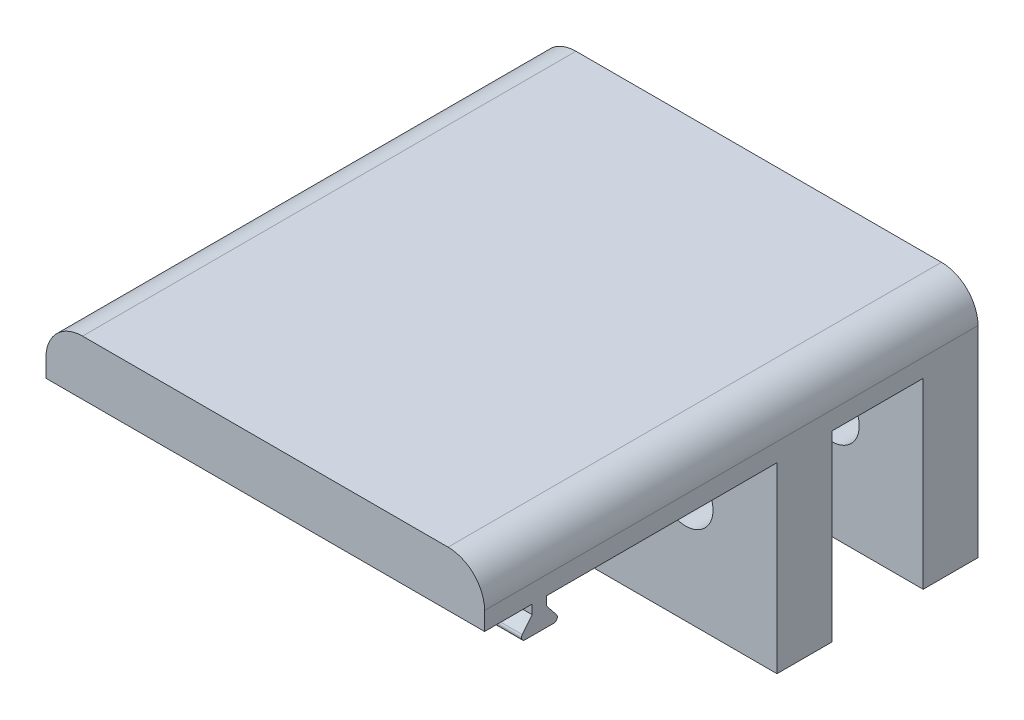
ISO-10303-21;
HEADER;
FILE_DESCRIPTION(('STEP AP214'),'2;1');
FILE_NAME('part.step','',(''),(''),'','','');
FILE_SCHEMA(('AUTOMOTIVE_DESIGN { 1 0 10303 214 1 1 1 1 }'));
ENDSEC;
DATA;
#1=APPLICATION_CONTEXT('core data for automotive mechanical design processes');
#2=APPLICATION_PROTOCOL_DEFINITION('international standard','automotive_design',2000,#1);
#3=PRODUCT_CONTEXT('',#1,'mechanical');
#4=PRODUCT('Part','Part','',(#3));
#5=PRODUCT_RELATED_PRODUCT_CATEGORY('part','',(#4));
#6=PRODUCT_DEFINITION_FORMATION('','',#4);
#7=PRODUCT_DEFINITION_CONTEXT('part definition',#1,'design');
#8=PRODUCT_DEFINITION('design','',#6,#7);
#9=PRODUCT_DEFINITION_SHAPE('','',#8);
#10=(LENGTH_UNIT() NAMED_UNIT(*) SI_UNIT(.MILLI.,.METRE.));
#11=(NAMED_UNIT(*) PLANE_ANGLE_UNIT() SI_UNIT($,.RADIAN.));
#12=(NAMED_UNIT(*) SI_UNIT($,.STERADIAN.) SOLID_ANGLE_UNIT());
#13=UNCERTAINTY_MEASURE_WITH_UNIT(LENGTH_MEASURE(1.E-05),#10,'distance_accuracy_value','');
#14=(GEOMETRIC_REPRESENTATION_CONTEXT(3) GLOBAL_UNCERTAINTY_ASSIGNED_CONTEXT((#13)) GLOBAL_UNIT_ASSIGNED_CONTEXT((#10,
#11,#12)) REPRESENTATION_CONTEXT('',''));
#15=CARTESIAN_POINT('',(0.,0.,0.));
#16=DIRECTION('',(0.,0.,1.));
#17=DIRECTION('',(1.,0.,0.));
#18=AXIS2_PLACEMENT_3D('',#15,#16,#17);
#19=CARTESIAN_POINT('',(-12.,5.,21.5));
#20=DIRECTION('',(0.,1.,0.));
#21=DIRECTION('',(0.,0.,1.));
#22=AXIS2_PLACEMENT_3D('',#19,#20,#21);
#23=PLANE('',#22);
#24=DIRECTION('',(1.,0.,0.));
#25=VECTOR('',#24,1.);
#26=CARTESIAN_POINT('',(-12.,5.,18.1));
#27=LINE('',#26,#25);
#28=CARTESIAN_POINT('',(-12.,5.,18.1));
#29=VERTEX_POINT('',#28);
#30=CARTESIAN_POINT('',(12.,5.,18.1));
#31=VERTEX_POINT('',#30);
#32=EDGE_CURVE('E206',#29,#31,#27,.T.);
#33=ORIENTED_EDGE('',*,*,#32,.F.);
#34=DIRECTION('',(0.,0.,-1.));
#35=VECTOR('',#34,1.);
#36=CARTESIAN_POINT('',(-12.,5.,21.5));
#37=LINE('',#36,#35);
#38=CARTESIAN_POINT('',(-12.,5.,5.5));
#39=VERTEX_POINT('',#38);
#40=EDGE_CURVE('E194',#29,#39,#37,.T.);
#41=ORIENTED_EDGE('',*,*,#40,.T.);
#42=DIRECTION('',(1.,0.,0.));
#43=VECTOR('',#42,1.);
#44=CARTESIAN_POINT('',(-12.,5.,5.5));
#45=LINE('',#44,#43);
#46=CARTESIAN_POINT('',(12.,5.,5.5));
#47=VERTEX_POINT('',#46);
#48=EDGE_CURVE('E250',#39,#47,#45,.T.);
#49=ORIENTED_EDGE('',*,*,#48,.T.);
#50=DIRECTION('',(0.,0.,-1.));
#51=VECTOR('',#50,1.);
#52=CARTESIAN_POINT('',(12.,5.,21.5));
#53=LINE('',#52,#51);
#54=EDGE_CURVE('E268',#31,#47,#53,.T.);
#55=ORIENTED_EDGE('',*,*,#54,.F.);
#56=EDGE_LOOP('',(#33,#41,#49,#55));
#57=FACE_BOUND('',#56,.T.);
#58=ADVANCED_FACE('F50',(#57),#23,.F.);
#59=CARTESIAN_POINT('',(0.,0.,5.5));
#60=DIRECTION('',(0.,0.,-1.));
#61=DIRECTION('',(-1.,0.,0.));
#62=AXIS2_PLACEMENT_3D('',#59,#60,#61);
#63=PLANE('',#62);
#64=CARTESIAN_POINT('',(7.,1.,5.5));
#65=DIRECTION('',(0.,0.,1.));
#66=DIRECTION('',(-1.,0.,0.));
#67=AXIS2_PLACEMENT_3D('',#64,#65,#66);
#68=CIRCLE('',#67,1.5);
#69=CARTESIAN_POINT('',(5.5,1.,5.5));
#70=VERTEX_POINT('',#69);
#71=EDGE_CURVE('E336',#70,#70,#68,.T.);
#72=ORIENTED_EDGE('',*,*,#71,.F.);
#73=EDGE_LOOP('',(#72));
#74=FACE_BOUND('',#73,.T.);
#75=CARTESIAN_POINT('',(-7.,1.,5.5));
#76=DIRECTION('',(0.,0.,1.));
#77=DIRECTION('',(1.,0.,0.));
#78=AXIS2_PLACEMENT_3D('',#75,#76,#77);
#79=CIRCLE('',#78,1.5);
#80=CARTESIAN_POINT('',(-5.5,1.,5.5));
#81=VERTEX_POINT('',#80);
#82=EDGE_CURVE('E349',#81,#81,#79,.T.);
#83=ORIENTED_EDGE('',*,*,#82,.F.);
#84=EDGE_LOOP('',(#83));
#85=FACE_BOUND('',#84,.T.);
#86=ORIENTED_EDGE('',*,*,#48,.F.);
#87=DIRECTION('',(0.,-1.,0.));
#88=VECTOR('',#87,1.);
#89=CARTESIAN_POINT('',(-12.,-5.,5.5));
#90=LINE('',#89,#88);
#91=CARTESIAN_POINT('',(-12.,-5.,5.5));
#92=VERTEX_POINT('',#91);
#93=EDGE_CURVE('E356',#39,#92,#90,.T.);
#94=ORIENTED_EDGE('',*,*,#93,.T.);
#95=DIRECTION('',(1.,0.,0.));
#96=VECTOR('',#95,1.);
#97=CARTESIAN_POINT('',(-12.,-5.,5.5));
#98=LINE('',#97,#96);
#99=CARTESIAN_POINT('',(12.,-5.,5.5));
#100=VERTEX_POINT('',#99);
#101=EDGE_CURVE('E365',#92,#100,#98,.T.);
#102=ORIENTED_EDGE('',*,*,#101,.T.);
#103=DIRECTION('',(0.,1.,0.));
#104=VECTOR('',#103,1.);
#105=CARTESIAN_POINT('',(12.,-5.,5.5));
#106=LINE('',#105,#104);
#107=EDGE_CURVE('E354',#100,#47,#106,.T.);
#108=ORIENTED_EDGE('',*,*,#107,.T.);
#109=EDGE_LOOP('',(#86,#94,#102,#108));
#110=FACE_BOUND('',#109,.T.);
#111=ADVANCED_FACE('F484',(#74,#85,#110),#63,.F.);
#112=CARTESIAN_POINT('',(0.,5.,0.));
#113=DIRECTION('',(0.,1.,0.));
#114=DIRECTION('',(0.,0.,1.));
#115=AXIS2_PLACEMENT_3D('',#112,#113,#114);
#116=PLANE('',#115);
#117=DIRECTION('',(-1.,0.,0.));
#118=VECTOR('',#117,1.);
#119=CARTESIAN_POINT('',(12.,5.,-2.5));
#120=LINE('',#119,#118);
#121=CARTESIAN_POINT('',(12.,5.,-2.5));
#122=VERTEX_POINT('',#121);
#123=CARTESIAN_POINT('',(-12.,5.,-2.5));
#124=VERTEX_POINT('',#123);
#125=EDGE_CURVE('E308',#122,#124,#120,.T.);
#126=ORIENTED_EDGE('',*,*,#125,.F.);
#127=DIRECTION('',(0.,0.,-1.));
#128=VECTOR('',#127,1.);
#129=CARTESIAN_POINT('',(12.,5.,-5.5));
#130=LINE('',#129,#128);
#131=CARTESIAN_POINT('',(12.,5.,2.5));
#132=VERTEX_POINT('',#131);
#133=EDGE_CURVE('E329',#132,#122,#130,.T.);
#134=ORIENTED_EDGE('',*,*,#133,.F.);
#135=DIRECTION('',(-1.,0.,0.));
#136=VECTOR('',#135,1.);
#137=CARTESIAN_POINT('',(-12.,5.,2.5));
#138=LINE('',#137,#136);
#139=CARTESIAN_POINT('',(-12.,5.,2.5));
#140=VERTEX_POINT('',#139);
#141=EDGE_CURVE('E367',#132,#140,#138,.T.);
#142=ORIENTED_EDGE('',*,*,#141,.T.);
#143=DIRECTION('',(0.,0.,1.));
#144=VECTOR('',#143,1.);
#145=CARTESIAN_POINT('',(-12.,5.,-5.5));
#146=LINE('',#145,#144);
#147=EDGE_CURVE('E319',#124,#140,#146,.T.);
#148=ORIENTED_EDGE('',*,*,#147,.F.);
#149=EDGE_LOOP('',(#126,#134,#142,#148));
#150=FACE_BOUND('',#149,.T.);
#151=ADVANCED_FACE('F498',(#150),#116,.F.);
#152=CARTESIAN_POINT('',(0.,0.,2.5));
#153=DIRECTION('',(0.,0.,-1.));
#154=DIRECTION('',(-1.,0.,0.));
#155=AXIS2_PLACEMENT_3D('',#152,#153,#154);
#156=PLANE('',#155);
#157=CARTESIAN_POINT('',(-7.,1.,2.5));
#158=DIRECTION('',(0.,0.,1.));
#159=DIRECTION('',(1.,0.,0.));
#160=AXIS2_PLACEMENT_3D('',#157,#158,#159);
#161=CIRCLE('',#160,1.5);
#162=CARTESIAN_POINT('',(-5.5,1.,2.5));
#163=VERTEX_POINT('',#162);
#164=EDGE_CURVE('E345',#163,#163,#161,.T.);
#165=ORIENTED_EDGE('',*,*,#164,.T.);
#166=EDGE_LOOP('',(#165));
#167=FACE_BOUND('',#166,.T.);
#168=DIRECTION('',(0.,1.,0.));
#169=VECTOR('',#168,1.);
#170=CARTESIAN_POINT('',(12.,-5.,2.5));
#171=LINE('',#170,#169);
#172=CARTESIAN_POINT('',(12.,-5.,2.5));
#173=VERTEX_POINT('',#172);
#174=EDGE_CURVE('E347',#173,#132,#171,.T.);
#175=ORIENTED_EDGE('',*,*,#174,.F.);
#176=DIRECTION('',(1.,0.,0.));
#177=VECTOR('',#176,1.);
#178=CARTESIAN_POINT('',(-12.,-5.,2.5));
#179=LINE('',#178,#177);
#180=CARTESIAN_POINT('',(-12.,-5.,2.5));
#181=VERTEX_POINT('',#180);
#182=EDGE_CURVE('E360',#181,#173,#179,.T.);
#183=ORIENTED_EDGE('',*,*,#182,.F.);
#184=DIRECTION('',(0.,-1.,0.));
#185=VECTOR('',#184,1.);
#186=CARTESIAN_POINT('',(-12.,-5.,2.5));
#187=LINE('',#186,#185);
#188=EDGE_CURVE('E373',#140,#181,#187,.T.);
#189=ORIENTED_EDGE('',*,*,#188,.F.);
#190=ORIENTED_EDGE('',*,*,#141,.F.);
#191=EDGE_LOOP('',(#175,#183,#189,#190));
#192=FACE_BOUND('',#191,.T.);
#193=CARTESIAN_POINT('',(7.,1.,2.5));
#194=DIRECTION('',(0.,0.,1.));
#195=DIRECTION('',(-1.,0.,0.));
#196=AXIS2_PLACEMENT_3D('',#193,#194,#195);
#197=CIRCLE('',#196,1.5);
#198=CARTESIAN_POINT('',(5.5,1.,2.5));
#199=VERTEX_POINT('',#198);
#200=EDGE_CURVE('E340',#199,#199,#197,.T.);
#201=ORIENTED_EDGE('',*,*,#200,.T.);
#202=EDGE_LOOP('',(#201));
#203=FACE_BOUND('',#202,.T.);
#204=ADVANCED_FACE('F492',(#167,#192,#203),#156,.T.);
#205=CARTESIAN_POINT('',(12.,-5.,5.5));
#206=DIRECTION('',(-1.,0.,0.));
#207=DIRECTION('',(0.,0.,1.));
#208=AXIS2_PLACEMENT_3D('',#205,#206,#207);
#209=PLANE('',#208);
#210=DIRECTION('',(0.,-1.,0.));
#211=VECTOR('',#210,1.);
#212=CARTESIAN_POINT('',(12.,8.,-5.5));
#213=LINE('',#212,#211);
#214=CARTESIAN_POINT('',(12.,6.,-5.5));
#215=VERTEX_POINT('',#214);
#216=CARTESIAN_POINT('',(12.,-5.,-5.5));
#217=VERTEX_POINT('',#216);
#218=EDGE_CURVE('E334',#215,#217,#213,.T.);
#219=ORIENTED_EDGE('',*,*,#218,.F.);
#220=DIRECTION('',(0.,0.,-1.));
#221=VECTOR('',#220,1.);
#222=CARTESIAN_POINT('',(12.,6.,21.5));
#223=LINE('',#222,#221);
#224=CARTESIAN_POINT('',(12.,6.,21.5));
#225=VERTEX_POINT('',#224);
#226=EDGE_CURVE('E73',#215,#225,#223,.F.);
#227=ORIENTED_EDGE('',*,*,#226,.T.);
#228=DIRECTION('',(0.,1.,0.));
#229=VECTOR('',#228,1.);
#230=CARTESIAN_POINT('',(12.,8.,21.5));
#231=LINE('',#230,#229);
#232=CARTESIAN_POINT('',(12.,5.,21.5));
#233=VERTEX_POINT('',#232);
#234=EDGE_CURVE('E258',#233,#225,#231,.T.);
#235=ORIENTED_EDGE('',*,*,#234,.F.);
#236=CARTESIAN_POINT('',(12.,5.,18.9));
#237=VERTEX_POINT('',#236);
#238=EDGE_CURVE('E267',#233,#237,#53,.T.);
#239=ORIENTED_EDGE('',*,*,#238,.T.);
#240=DIRECTION('',(0.,-1.,0.));
#241=VECTOR('',#240,1.);
#242=CARTESIAN_POINT('',(12.,0.,18.9));
#243=LINE('',#242,#241);
#244=CARTESIAN_POINT('',(12.,4.5,18.9));
#245=VERTEX_POINT('',#244);
#246=EDGE_CURVE('E240',#237,#245,#243,.T.);
#247=ORIENTED_EDGE('',*,*,#246,.T.);
#248=DIRECTION('',(0.,-0.78086880944303,0.624695047554424));
#249=VECTOR('',#248,1.);
#250=CARTESIAN_POINT('',(12.,10.9756097560976,13.719512195122));
#251=LINE('',#250,#249);
#252=CARTESIAN_POINT('',(12.,3.82493900951088,19.4400487923913));
#253=VERTEX_POINT('',#252);
#254=EDGE_CURVE('E218',#245,#253,#251,.T.);
#255=ORIENTED_EDGE('',*,*,#254,.T.);
#256=CARTESIAN_POINT('',(12.,3.7,19.2838750305027));
#257=DIRECTION('',(-1.,0.,0.));
#258=DIRECTION('',(0.,0.,1.));
#259=AXIS2_PLACEMENT_3D('',#256,#257,#258);
#260=CIRCLE('',#259,0.2);
#261=CARTESIAN_POINT('',(12.,3.5,19.2838750305027));
#262=VERTEX_POINT('',#261);
#263=EDGE_CURVE('E391',#253,#262,#260,.F.);
#264=ORIENTED_EDGE('',*,*,#263,.T.);
#265=DIRECTION('',(0.,0.,-1.));
#266=VECTOR('',#265,1.);
#267=CARTESIAN_POINT('',(12.,3.5,0.));
#268=LINE('',#267,#266);
#269=CARTESIAN_POINT('',(12.,3.5,17.7161249694973));
#270=VERTEX_POINT('',#269);
#271=EDGE_CURVE('E213',#262,#270,#268,.T.);
#272=ORIENTED_EDGE('',*,*,#271,.T.);
#273=CARTESIAN_POINT('',(12.,3.7,17.7161249694973));
#274=DIRECTION('',(-1.,0.,0.));
#275=DIRECTION('',(0.,0.,1.));
#276=AXIS2_PLACEMENT_3D('',#273,#274,#275);
#277=CIRCLE('',#276,0.2);
#278=CARTESIAN_POINT('',(12.,3.82493900951088,17.5599512076087));
#279=VERTEX_POINT('',#278);
#280=EDGE_CURVE('E392',#270,#279,#277,.F.);
#281=ORIENTED_EDGE('',*,*,#280,.T.);
#282=DIRECTION('',(0.,-0.78086880944303,-0.624695047554424));
#283=VECTOR('',#282,1.);
#284=CARTESIAN_POINT('',(12.,-7.07317073170732,8.84146341463415));
#285=LINE('',#284,#283);
#286=CARTESIAN_POINT('',(12.,4.5,18.1));
#287=VERTEX_POINT('',#286);
#288=EDGE_CURVE('E235',#287,#279,#285,.T.);
#289=ORIENTED_EDGE('',*,*,#288,.F.);
#290=DIRECTION('',(0.,-1.,0.));
#291=VECTOR('',#290,1.);
#292=CARTESIAN_POINT('',(12.,0.,18.1));
#293=LINE('',#292,#291);
#294=EDGE_CURVE('E201',#31,#287,#293,.T.);
#295=ORIENTED_EDGE('',*,*,#294,.F.);
#296=ORIENTED_EDGE('',*,*,#54,.T.);
#297=ORIENTED_EDGE('',*,*,#107,.F.);
#298=DIRECTION('',(0.,0.,-1.));
#299=VECTOR('',#298,1.);
#300=CARTESIAN_POINT('',(12.,-5.,5.5));
#301=LINE('',#300,#299);
#302=EDGE_CURVE('E362',#100,#173,#301,.T.);
#303=ORIENTED_EDGE('',*,*,#302,.T.);
#304=ORIENTED_EDGE('',*,*,#174,.T.);
#305=ORIENTED_EDGE('',*,*,#133,.T.);
#306=DIRECTION('',(0.,1.,0.));
#307=VECTOR('',#306,1.);
#308=CARTESIAN_POINT('',(12.,-5.,-2.5));
#309=LINE('',#308,#307);
#310=CARTESIAN_POINT('',(12.,-5.,-2.5));
#311=VERTEX_POINT('',#310);
#312=EDGE_CURVE('E302',#311,#122,#309,.T.);
#313=ORIENTED_EDGE('',*,*,#312,.F.);
#314=DIRECTION('',(0.,0.,1.));
#315=VECTOR('',#314,1.);
#316=CARTESIAN_POINT('',(12.,-5.,-5.5));
#317=LINE('',#316,#315);
#318=EDGE_CURVE('E299',#217,#311,#317,.T.);
#319=ORIENTED_EDGE('',*,*,#318,.F.);
#320=EDGE_LOOP('',(#219,#227,#235,#239,#247,#255,#264,#272,#281,#289,#295,#296,#297,#303,#304,
#305,#313,#319));
#321=FACE_BOUND('',#320,.T.);
#322=ADVANCED_FACE('F442',(#321),#209,.F.);
#323=CARTESIAN_POINT('',(-12.,-5.,5.5));
#324=DIRECTION('',(1.,0.,0.));
#325=DIRECTION('',(0.,0.,-1.));
#326=AXIS2_PLACEMENT_3D('',#323,#324,#325);
#327=PLANE('',#326);
#328=DIRECTION('',(0.,-1.,0.));
#329=VECTOR('',#328,1.);
#330=CARTESIAN_POINT('',(-12.,8.,21.5));
#331=LINE('',#330,#329);
#332=CARTESIAN_POINT('',(-12.,6.,21.5));
#333=VERTEX_POINT('',#332);
#334=CARTESIAN_POINT('',(-12.,5.,21.5));
#335=VERTEX_POINT('',#334);
#336=EDGE_CURVE('E251',#333,#335,#331,.T.);
#337=ORIENTED_EDGE('',*,*,#336,.F.);
#338=DIRECTION('',(0.,0.,1.));
#339=VECTOR('',#338,1.);
#340=CARTESIAN_POINT('',(-12.,6.,-5.5));
#341=LINE('',#340,#339);
#342=CARTESIAN_POINT('',(-12.,6.,-5.5));
#343=VERTEX_POINT('',#342);
#344=EDGE_CURVE('E11',#333,#343,#341,.F.);
#345=ORIENTED_EDGE('',*,*,#344,.T.);
#346=DIRECTION('',(0.,-1.,0.));
#347=VECTOR('',#346,1.);
#348=CARTESIAN_POINT('',(-12.,8.,-5.5));
#349=LINE('',#348,#347);
#350=CARTESIAN_POINT('',(-12.,-5.,-5.5));
#351=VERTEX_POINT('',#350);
#352=EDGE_CURVE('E323',#343,#351,#349,.T.);
#353=ORIENTED_EDGE('',*,*,#352,.T.);
#354=DIRECTION('',(0.,0.,1.));
#355=VECTOR('',#354,1.);
#356=CARTESIAN_POINT('',(-12.,-5.,-5.5));
#357=LINE('',#356,#355);
#358=CARTESIAN_POINT('',(-12.,-5.,-2.5));
#359=VERTEX_POINT('',#358);
#360=EDGE_CURVE('E314',#351,#359,#357,.T.);
#361=ORIENTED_EDGE('',*,*,#360,.T.);
#362=DIRECTION('',(0.,-1.,0.));
#363=VECTOR('',#362,1.);
#364=CARTESIAN_POINT('',(-12.,5.,-2.5));
#365=LINE('',#364,#363);
#366=EDGE_CURVE('E297',#124,#359,#365,.T.);
#367=ORIENTED_EDGE('',*,*,#366,.F.);
#368=ORIENTED_EDGE('',*,*,#147,.T.);
#369=ORIENTED_EDGE('',*,*,#188,.T.);
#370=DIRECTION('',(0.,0.,-1.));
#371=VECTOR('',#370,1.);
#372=CARTESIAN_POINT('',(-12.,-5.,5.5));
#373=LINE('',#372,#371);
#374=EDGE_CURVE('E382',#92,#181,#373,.T.);
#375=ORIENTED_EDGE('',*,*,#374,.F.);
#376=ORIENTED_EDGE('',*,*,#93,.F.);
#377=ORIENTED_EDGE('',*,*,#40,.F.);
#378=DIRECTION('',(0.,-1.,0.));
#379=VECTOR('',#378,1.);
#380=CARTESIAN_POINT('',(-12.,0.,18.1));
#381=LINE('',#380,#379);
#382=CARTESIAN_POINT('',(-12.,4.5,18.1));
#383=VERTEX_POINT('',#382);
#384=EDGE_CURVE('E187',#29,#383,#381,.T.);
#385=ORIENTED_EDGE('',*,*,#384,.T.);
#386=DIRECTION('',(0.,-0.78086880944303,-0.624695047554424));
#387=VECTOR('',#386,1.);
#388=CARTESIAN_POINT('',(-12.,-7.07317073170732,8.84146341463415));
#389=LINE('',#388,#387);
#390=CARTESIAN_POINT('',(-12.,3.82493900951088,17.5599512076087));
#391=VERTEX_POINT('',#390);
#392=EDGE_CURVE('E188',#383,#391,#389,.T.);
#393=ORIENTED_EDGE('',*,*,#392,.T.);
#394=CARTESIAN_POINT('',(-12.,3.7,17.7161249694973));
#395=DIRECTION('',(1.,0.,0.));
#396=DIRECTION('',(0.,0.,-1.));
#397=AXIS2_PLACEMENT_3D('',#394,#395,#396);
#398=CIRCLE('',#397,0.2);
#399=CARTESIAN_POINT('',(-12.,3.5,17.7161249694973));
#400=VERTEX_POINT('',#399);
#401=EDGE_CURVE('E401',#391,#400,#398,.F.);
#402=ORIENTED_EDGE('',*,*,#401,.T.);
#403=DIRECTION('',(0.,0.,-1.));
#404=VECTOR('',#403,1.);
#405=CARTESIAN_POINT('',(-12.,3.5,0.));
#406=LINE('',#405,#404);
#407=CARTESIAN_POINT('',(-12.,3.5,19.2838750305027));
#408=VERTEX_POINT('',#407);
#409=EDGE_CURVE('E209',#408,#400,#406,.T.);
#410=ORIENTED_EDGE('',*,*,#409,.F.);
#411=CARTESIAN_POINT('',(-12.,3.7,19.2838750305027));
#412=DIRECTION('',(1.,0.,0.));
#413=DIRECTION('',(0.,0.,-1.));
#414=AXIS2_PLACEMENT_3D('',#411,#412,#413);
#415=CIRCLE('',#414,0.2);
#416=CARTESIAN_POINT('',(-12.,3.82493900951088,19.4400487923913));
#417=VERTEX_POINT('',#416);
#418=EDGE_CURVE('E397',#408,#417,#415,.F.);
#419=ORIENTED_EDGE('',*,*,#418,.T.);
#420=DIRECTION('',(0.,-0.78086880944303,0.624695047554424));
#421=VECTOR('',#420,1.);
#422=CARTESIAN_POINT('',(-12.,10.9756097560976,13.719512195122));
#423=LINE('',#422,#421);
#424=CARTESIAN_POINT('',(-12.,4.5,18.9));
#425=VERTEX_POINT('',#424);
#426=EDGE_CURVE('E222',#425,#417,#423,.T.);
#427=ORIENTED_EDGE('',*,*,#426,.F.);
#428=DIRECTION('',(0.,-1.,0.));
#429=VECTOR('',#428,1.);
#430=CARTESIAN_POINT('',(-12.,0.,18.9));
#431=LINE('',#430,#429);
#432=CARTESIAN_POINT('',(-12.,5.,18.9));
#433=VERTEX_POINT('',#432);
#434=EDGE_CURVE('E196',#433,#425,#431,.T.);
#435=ORIENTED_EDGE('',*,*,#434,.F.);
#436=EDGE_CURVE('E274',#335,#433,#37,.T.);
#437=ORIENTED_EDGE('',*,*,#436,.F.);
#438=EDGE_LOOP('',(#337,#345,#353,#361,#367,#368,#369,#375,#376,#377,#385,#393,#402,#410,#419,
#427,#435,#437));
#439=FACE_BOUND('',#438,.T.);
#440=ADVANCED_FACE('F189',(#439),#327,.F.);
#441=CARTESIAN_POINT('',(-12.,-5.,5.5));
#442=DIRECTION('',(0.,1.,0.));
#443=DIRECTION('',(0.,0.,1.));
#444=AXIS2_PLACEMENT_3D('',#441,#442,#443);
#445=PLANE('',#444);
#446=ORIENTED_EDGE('',*,*,#182,.T.);
#447=ORIENTED_EDGE('',*,*,#302,.F.);
#448=ORIENTED_EDGE('',*,*,#101,.F.);
#449=ORIENTED_EDGE('',*,*,#374,.T.);
#450=EDGE_LOOP('',(#446,#447,#448,#449));
#451=FACE_BOUND('',#450,.T.);
#452=ADVANCED_FACE('F493',(#451),#445,.F.);
#453=CARTESIAN_POINT('',(-7.,1.,5.5));
#454=DIRECTION('',(0.,0.,-1.));
#455=DIRECTION('',(-1.,0.,0.));
#456=AXIS2_PLACEMENT_3D('',#453,#454,#455);
#457=CYLINDRICAL_SURFACE('',#456,1.5);
#458=ORIENTED_EDGE('',*,*,#82,.T.);
#459=EDGE_LOOP('',(#458));
#460=FACE_BOUND('',#459,.T.);
#461=ORIENTED_EDGE('',*,*,#164,.F.);
#462=EDGE_LOOP('',(#461));
#463=FACE_BOUND('',#462,.T.);
#464=ADVANCED_FACE('F549',(#460,#463),#457,.F.);
#465=CARTESIAN_POINT('',(7.,1.,5.5));
#466=DIRECTION('',(0.,0.,-1.));
#467=DIRECTION('',(-1.,0.,0.));
#468=AXIS2_PLACEMENT_3D('',#465,#466,#467);
#469=CYLINDRICAL_SURFACE('',#468,1.5);
#470=ORIENTED_EDGE('',*,*,#71,.T.);
#471=EDGE_LOOP('',(#470));
#472=FACE_BOUND('',#471,.T.);
#473=ORIENTED_EDGE('',*,*,#200,.F.);
#474=EDGE_LOOP('',(#473));
#475=FACE_BOUND('',#474,.T.);
#476=ADVANCED_FACE('F539',(#472,#475),#469,.F.);
#477=CARTESIAN_POINT('',(-12.,8.,-5.5));
#478=DIRECTION('',(0.,0.,1.));
#479=DIRECTION('',(1.,0.,0.));
#480=AXIS2_PLACEMENT_3D('',#477,#478,#479);
#481=PLANE('',#480);
#482=DIRECTION('',(-1.,0.,0.));
#483=VECTOR('',#482,1.);
#484=CARTESIAN_POINT('',(-12.,8.,-5.5));
#485=LINE('',#484,#483);
#486=CARTESIAN_POINT('',(10.,8.,-5.5));
#487=VERTEX_POINT('',#486);
#488=CARTESIAN_POINT('',(-10.,8.,-5.5));
#489=VERTEX_POINT('',#488);
#490=EDGE_CURVE('E322',#487,#489,#485,.T.);
#491=ORIENTED_EDGE('',*,*,#490,.F.);
#492=CARTESIAN_POINT('',(10.,6.,-5.5));
#493=DIRECTION('',(0.,0.,1.));
#494=DIRECTION('',(1.,0.,0.));
#495=AXIS2_PLACEMENT_3D('',#492,#493,#494);
#496=CIRCLE('',#495,2.);
#497=EDGE_CURVE('E423',#487,#215,#496,.F.);
#498=ORIENTED_EDGE('',*,*,#497,.T.);
#499=ORIENTED_EDGE('',*,*,#218,.T.);
#500=DIRECTION('',(1.,0.,0.));
#501=VECTOR('',#500,1.);
#502=CARTESIAN_POINT('',(-12.,-5.,-5.5));
#503=LINE('',#502,#501);
#504=EDGE_CURVE('E294',#351,#217,#503,.T.);
#505=ORIENTED_EDGE('',*,*,#504,.F.);
#506=ORIENTED_EDGE('',*,*,#352,.F.);
#507=CARTESIAN_POINT('',(-10.,6.,-5.5));
#508=DIRECTION('',(0.,0.,1.));
#509=DIRECTION('',(1.,0.,0.));
#510=AXIS2_PLACEMENT_3D('',#507,#508,#509);
#511=CIRCLE('',#510,2.);
#512=EDGE_CURVE('E416',#343,#489,#511,.F.);
#513=ORIENTED_EDGE('',*,*,#512,.T.);
#514=EDGE_LOOP('',(#491,#498,#499,#505,#506,#513));
#515=FACE_BOUND('',#514,.T.);
#516=CARTESIAN_POINT('',(-7.,1.,-5.5));
#517=DIRECTION('',(0.,0.,1.));
#518=DIRECTION('',(1.,0.,0.));
#519=AXIS2_PLACEMENT_3D('',#516,#517,#518);
#520=CIRCLE('',#519,1.5);
#521=CARTESIAN_POINT('',(-5.5,1.,-5.5));
#522=VERTEX_POINT('',#521);
#523=EDGE_CURVE('E276',#522,#522,#520,.T.);
#524=ORIENTED_EDGE('',*,*,#523,.T.);
#525=EDGE_LOOP('',(#524));
#526=FACE_BOUND('',#525,.T.);
#527=CARTESIAN_POINT('',(7.,1.,-5.5));
#528=DIRECTION('',(0.,0.,1.));
#529=DIRECTION('',(1.,0.,0.));
#530=AXIS2_PLACEMENT_3D('',#527,#528,#529);
#531=CIRCLE('',#530,1.5);
#532=CARTESIAN_POINT('',(8.5,1.,-5.5));
#533=VERTEX_POINT('',#532);
#534=EDGE_CURVE('E290',#533,#533,#531,.T.);
#535=ORIENTED_EDGE('',*,*,#534,.T.);
#536=EDGE_LOOP('',(#535));
#537=FACE_BOUND('',#536,.T.);
#538=ADVANCED_FACE('F437',(#515,#526,#537),#481,.F.);
#539=CARTESIAN_POINT('',(0.,8.,0.));
#540=DIRECTION('',(0.,1.,0.));
#541=DIRECTION('',(0.,0.,1.));
#542=AXIS2_PLACEMENT_3D('',#539,#540,#541);
#543=PLANE('',#542);
#544=DIRECTION('',(-1.,0.,0.));
#545=VECTOR('',#544,1.);
#546=CARTESIAN_POINT('',(-12.,8.,21.5));
#547=LINE('',#546,#545);
#548=CARTESIAN_POINT('',(10.,8.,21.5));
#549=VERTEX_POINT('',#548);
#550=CARTESIAN_POINT('',(-10.,8.,21.5));
#551=VERTEX_POINT('',#550);
#552=EDGE_CURVE('E265',#549,#551,#547,.T.);
#553=ORIENTED_EDGE('',*,*,#552,.F.);
#554=DIRECTION('',(0.,0.,-1.));
#555=VECTOR('',#554,1.);
#556=CARTESIAN_POINT('',(10.,8.,-5.5));
#557=LINE('',#556,#555);
#558=EDGE_CURVE('E413',#549,#487,#557,.T.);
#559=ORIENTED_EDGE('',*,*,#558,.T.);
#560=ORIENTED_EDGE('',*,*,#490,.T.);
#561=DIRECTION('',(0.,0.,1.));
#562=VECTOR('',#561,1.);
#563=CARTESIAN_POINT('',(-10.,8.,21.5));
#564=LINE('',#563,#562);
#565=EDGE_CURVE('E408',#489,#551,#564,.T.);
#566=ORIENTED_EDGE('',*,*,#565,.T.);
#567=EDGE_LOOP('',(#553,#559,#560,#566));
#568=FACE_BOUND('',#567,.T.);
#569=ADVANCED_FACE('F432',(#568),#543,.T.);
#570=CARTESIAN_POINT('',(-12.,-5.,-5.5));
#571=DIRECTION('',(0.,-1.,0.));
#572=DIRECTION('',(0.,0.,-1.));
#573=AXIS2_PLACEMENT_3D('',#570,#571,#572);
#574=PLANE('',#573);
#575=DIRECTION('',(1.,0.,0.));
#576=VECTOR('',#575,1.);
#577=CARTESIAN_POINT('',(-12.,-5.,-2.5));
#578=LINE('',#577,#576);
#579=EDGE_CURVE('E293',#359,#311,#578,.T.);
#580=ORIENTED_EDGE('',*,*,#579,.F.);
#581=ORIENTED_EDGE('',*,*,#360,.F.);
#582=ORIENTED_EDGE('',*,*,#504,.T.);
#583=ORIENTED_EDGE('',*,*,#318,.T.);
#584=EDGE_LOOP('',(#580,#581,#582,#583));
#585=FACE_BOUND('',#584,.T.);
#586=ADVANCED_FACE('F449',(#585),#574,.T.);
#587=CARTESIAN_POINT('',(0.,0.,-2.5));
#588=DIRECTION('',(0.,0.,1.));
#589=DIRECTION('',(1.,0.,0.));
#590=AXIS2_PLACEMENT_3D('',#587,#588,#589);
#591=PLANE('',#590);
#592=CARTESIAN_POINT('',(-7.,1.,-2.5));
#593=DIRECTION('',(0.,0.,1.));
#594=DIRECTION('',(1.,0.,0.));
#595=AXIS2_PLACEMENT_3D('',#592,#593,#594);
#596=CIRCLE('',#595,1.5);
#597=CARTESIAN_POINT('',(-5.5,1.,-2.5));
#598=VERTEX_POINT('',#597);
#599=EDGE_CURVE('E279',#598,#598,#596,.T.);
#600=ORIENTED_EDGE('',*,*,#599,.F.);
#601=EDGE_LOOP('',(#600));
#602=FACE_BOUND('',#601,.T.);
#603=CARTESIAN_POINT('',(7.,1.,-2.5));
#604=DIRECTION('',(0.,0.,1.));
#605=DIRECTION('',(1.,0.,0.));
#606=AXIS2_PLACEMENT_3D('',#603,#604,#605);
#607=CIRCLE('',#606,1.5);
#608=CARTESIAN_POINT('',(8.5,1.,-2.5));
#609=VERTEX_POINT('',#608);
#610=EDGE_CURVE('E285',#609,#609,#607,.T.);
#611=ORIENTED_EDGE('',*,*,#610,.F.);
#612=EDGE_LOOP('',(#611));
#613=FACE_BOUND('',#612,.T.);
#614=ORIENTED_EDGE('',*,*,#579,.T.);
#615=ORIENTED_EDGE('',*,*,#312,.T.);
#616=ORIENTED_EDGE('',*,*,#125,.T.);
#617=ORIENTED_EDGE('',*,*,#366,.T.);
#618=EDGE_LOOP('',(#614,#615,#616,#617));
#619=FACE_BOUND('',#618,.T.);
#620=ADVANCED_FACE('F499',(#602,#613,#619),#591,.T.);
#621=CARTESIAN_POINT('',(7.,1.,-5.5));
#622=DIRECTION('',(0.,0.,1.));
#623=DIRECTION('',(1.,0.,0.));
#624=AXIS2_PLACEMENT_3D('',#621,#622,#623);
#625=CYLINDRICAL_SURFACE('',#624,1.5);
#626=ORIENTED_EDGE('',*,*,#534,.F.);
#627=EDGE_LOOP('',(#626));
#628=FACE_BOUND('',#627,.T.);
#629=ORIENTED_EDGE('',*,*,#610,.T.);
#630=EDGE_LOOP('',(#629));
#631=FACE_BOUND('',#630,.T.);
#632=ADVANCED_FACE('F503',(#628,#631),#625,.F.);
#633=CARTESIAN_POINT('',(-7.,1.,-5.5));
#634=DIRECTION('',(0.,0.,1.));
#635=DIRECTION('',(1.,0.,0.));
#636=AXIS2_PLACEMENT_3D('',#633,#634,#635);
#637=CYLINDRICAL_SURFACE('',#636,1.5);
#638=ORIENTED_EDGE('',*,*,#523,.F.);
#639=EDGE_LOOP('',(#638));
#640=FACE_BOUND('',#639,.T.);
#641=ORIENTED_EDGE('',*,*,#599,.T.);
#642=EDGE_LOOP('',(#641));
#643=FACE_BOUND('',#642,.T.);
#644=ADVANCED_FACE('F509',(#640,#643),#637,.F.);
#645=ORIENTED_EDGE('',*,*,#436,.T.);
#646=DIRECTION('',(1.,0.,0.));
#647=VECTOR('',#646,1.);
#648=CARTESIAN_POINT('',(-12.,5.,18.9));
#649=LINE('',#648,#647);
#650=EDGE_CURVE('E247',#433,#237,#649,.T.);
#651=ORIENTED_EDGE('',*,*,#650,.T.);
#652=ORIENTED_EDGE('',*,*,#238,.F.);
#653=DIRECTION('',(1.,0.,0.));
#654=VECTOR('',#653,1.);
#655=CARTESIAN_POINT('',(-12.,5.,21.5));
#656=LINE('',#655,#654);
#657=EDGE_CURVE('E260',#335,#233,#656,.T.);
#658=ORIENTED_EDGE('',*,*,#657,.F.);
#659=EDGE_LOOP('',(#645,#651,#652,#658));
#660=FACE_BOUND('',#659,.T.);
#661=ADVANCED_FACE('F460',(#660),#23,.F.);
#662=CARTESIAN_POINT('',(0.,0.,21.5));
#663=DIRECTION('',(0.,0.,1.));
#664=DIRECTION('',(1.,0.,0.));
#665=AXIS2_PLACEMENT_3D('',#662,#663,#664);
#666=PLANE('',#665);
#667=ORIENTED_EDGE('',*,*,#234,.T.);
#668=CARTESIAN_POINT('',(10.,6.,21.5));
#669=DIRECTION('',(0.,0.,1.));
#670=DIRECTION('',(1.,0.,0.));
#671=AXIS2_PLACEMENT_3D('',#668,#669,#670);
#672=CIRCLE('',#671,2.);
#673=EDGE_CURVE('E57',#225,#549,#672,.T.);
#674=ORIENTED_EDGE('',*,*,#673,.T.);
#675=ORIENTED_EDGE('',*,*,#552,.T.);
#676=CARTESIAN_POINT('',(-10.,6.,21.5));
#677=DIRECTION('',(0.,0.,1.));
#678=DIRECTION('',(1.,0.,0.));
#679=AXIS2_PLACEMENT_3D('',#676,#677,#678);
#680=CIRCLE('',#679,2.);
#681=EDGE_CURVE('E64',#551,#333,#680,.T.);
#682=ORIENTED_EDGE('',*,*,#681,.T.);
#683=ORIENTED_EDGE('',*,*,#336,.T.);
#684=ORIENTED_EDGE('',*,*,#657,.T.);
#685=EDGE_LOOP('',(#667,#674,#675,#682,#683,#684));
#686=FACE_BOUND('',#685,.T.);
#687=ADVANCED_FACE('F427',(#686),#666,.T.);
#688=CARTESIAN_POINT('',(-12.,-7.07317073170732,8.84146341463415));
#689=DIRECTION('',(0.,-0.624695047554424,0.78086880944303));
#690=DIRECTION('',(0.,-0.78086880944303,-0.624695047554424));
#691=AXIS2_PLACEMENT_3D('',#688,#689,#690);
#692=PLANE('',#691);
#693=ORIENTED_EDGE('',*,*,#288,.T.);
#694=DIRECTION('',(1.,0.,0.));
#695=VECTOR('',#694,1.);
#696=CARTESIAN_POINT('',(-12.,3.82493900951088,17.5599512076087));
#697=LINE('',#696,#695);
#698=EDGE_CURVE('E214',#279,#391,#697,.F.);
#699=ORIENTED_EDGE('',*,*,#698,.T.);
#700=ORIENTED_EDGE('',*,*,#392,.F.);
#701=DIRECTION('',(1.,0.,0.));
#702=VECTOR('',#701,1.);
#703=CARTESIAN_POINT('',(-12.,4.5,18.1));
#704=LINE('',#703,#702);
#705=EDGE_CURVE('E197',#383,#287,#704,.T.);
#706=ORIENTED_EDGE('',*,*,#705,.T.);
#707=EDGE_LOOP('',(#693,#699,#700,#706));
#708=FACE_BOUND('',#707,.T.);
#709=ADVANCED_FACE('F212',(#708),#692,.F.);
#710=CARTESIAN_POINT('',(-12.,3.5,0.));
#711=DIRECTION('',(0.,-1.,0.));
#712=DIRECTION('',(0.,0.,-1.));
#713=AXIS2_PLACEMENT_3D('',#710,#711,#712);
#714=PLANE('',#713);
#715=ORIENTED_EDGE('',*,*,#409,.T.);
#716=DIRECTION('',(1.,0.,0.));
#717=VECTOR('',#716,1.);
#718=CARTESIAN_POINT('',(12.,3.5,17.7161249694973));
#719=LINE('',#718,#717);
#720=EDGE_CURVE('E389',#400,#270,#719,.T.);
#721=ORIENTED_EDGE('',*,*,#720,.T.);
#722=ORIENTED_EDGE('',*,*,#271,.F.);
#723=DIRECTION('',(1.,0.,0.));
#724=VECTOR('',#723,1.);
#725=CARTESIAN_POINT('',(-12.,3.5,19.2838750305027));
#726=LINE('',#725,#724);
#727=EDGE_CURVE('E383',#262,#408,#726,.F.);
#728=ORIENTED_EDGE('',*,*,#727,.T.);
#729=EDGE_LOOP('',(#715,#721,#722,#728));
#730=FACE_BOUND('',#729,.T.);
#731=ADVANCED_FACE('F475',(#730),#714,.T.);
#732=CARTESIAN_POINT('',(-12.,10.9756097560976,13.719512195122));
#733=DIRECTION('',(0.,0.624695047554424,0.78086880944303));
#734=DIRECTION('',(0.,-0.78086880944303,0.624695047554424));
#735=AXIS2_PLACEMENT_3D('',#732,#733,#734);
#736=PLANE('',#735);
#737=ORIENTED_EDGE('',*,*,#426,.T.);
#738=DIRECTION('',(1.,0.,0.));
#739=VECTOR('',#738,1.);
#740=CARTESIAN_POINT('',(-12.,3.82493900951089,19.4400487923913));
#741=LINE('',#740,#739);
#742=EDGE_CURVE('E407',#417,#253,#741,.T.);
#743=ORIENTED_EDGE('',*,*,#742,.T.);
#744=ORIENTED_EDGE('',*,*,#254,.F.);
#745=DIRECTION('',(1.,0.,0.));
#746=VECTOR('',#745,1.);
#747=CARTESIAN_POINT('',(-12.,4.5,18.9));
#748=LINE('',#747,#746);
#749=EDGE_CURVE('E242',#425,#245,#748,.T.);
#750=ORIENTED_EDGE('',*,*,#749,.F.);
#751=EDGE_LOOP('',(#737,#743,#744,#750));
#752=FACE_BOUND('',#751,.T.);
#753=ADVANCED_FACE('F464',(#752),#736,.T.);
#754=CARTESIAN_POINT('',(-12.,0.,18.9));
#755=DIRECTION('',(0.,0.,1.));
#756=DIRECTION('',(1.,0.,0.));
#757=AXIS2_PLACEMENT_3D('',#754,#755,#756);
#758=PLANE('',#757);
#759=ORIENTED_EDGE('',*,*,#246,.F.);
#760=ORIENTED_EDGE('',*,*,#650,.F.);
#761=ORIENTED_EDGE('',*,*,#434,.T.);
#762=ORIENTED_EDGE('',*,*,#749,.T.);
#763=EDGE_LOOP('',(#759,#760,#761,#762));
#764=FACE_BOUND('',#763,.T.);
#765=ADVANCED_FACE('F463',(#764),#758,.T.);
#766=CARTESIAN_POINT('',(-12.,0.,18.1));
#767=DIRECTION('',(0.,0.,1.));
#768=DIRECTION('',(1.,0.,0.));
#769=AXIS2_PLACEMENT_3D('',#766,#767,#768);
#770=PLANE('',#769);
#771=ORIENTED_EDGE('',*,*,#294,.T.);
#772=ORIENTED_EDGE('',*,*,#705,.F.);
#773=ORIENTED_EDGE('',*,*,#384,.F.);
#774=ORIENTED_EDGE('',*,*,#32,.T.);
#775=EDGE_LOOP('',(#771,#772,#773,#774));
#776=FACE_BOUND('',#775,.T.);
#777=ADVANCED_FACE('F203',(#776),#770,.F.);
#778=CARTESIAN_POINT('',(-12.,3.7,17.7161249694973));
#779=DIRECTION('',(-1.,0.,0.));
#780=DIRECTION('',(0.,0.,1.));
#781=AXIS2_PLACEMENT_3D('',#778,#779,#780);
#782=CYLINDRICAL_SURFACE('',#781,0.2);
#783=ORIENTED_EDGE('',*,*,#401,.F.);
#784=ORIENTED_EDGE('',*,*,#698,.F.);
#785=ORIENTED_EDGE('',*,*,#280,.F.);
#786=ORIENTED_EDGE('',*,*,#720,.F.);
#787=EDGE_LOOP('',(#783,#784,#785,#786));
#788=FACE_BOUND('',#787,.T.);
#789=ADVANCED_FACE('F479',(#788),#782,.T.);
#790=CARTESIAN_POINT('',(-12.,3.7,19.2838750305027));
#791=DIRECTION('',(1.,0.,0.));
#792=DIRECTION('',(0.,0.,-1.));
#793=AXIS2_PLACEMENT_3D('',#790,#791,#792);
#794=CYLINDRICAL_SURFACE('',#793,0.2);
#795=ORIENTED_EDGE('',*,*,#418,.F.);
#796=ORIENTED_EDGE('',*,*,#727,.F.);
#797=ORIENTED_EDGE('',*,*,#263,.F.);
#798=ORIENTED_EDGE('',*,*,#742,.F.);
#799=EDGE_LOOP('',(#795,#796,#797,#798));
#800=FACE_BOUND('',#799,.T.);
#801=ADVANCED_FACE('F466',(#800),#794,.T.);
#802=CARTESIAN_POINT('',(10.,6.,0.));
#803=DIRECTION('',(0.,0.,1.));
#804=DIRECTION('',(1.,0.,0.));
#805=AXIS2_PLACEMENT_3D('',#802,#803,#804);
#806=CYLINDRICAL_SURFACE('',#805,2.);
#807=ORIENTED_EDGE('',*,*,#673,.F.);
#808=ORIENTED_EDGE('',*,*,#226,.F.);
#809=ORIENTED_EDGE('',*,*,#497,.F.);
#810=ORIENTED_EDGE('',*,*,#558,.F.);
#811=EDGE_LOOP('',(#807,#808,#809,#810));
#812=FACE_BOUND('',#811,.T.);
#813=ADVANCED_FACE('F440',(#812),#806,.T.);
#814=CARTESIAN_POINT('',(-10.,6.,0.));
#815=DIRECTION('',(0.,0.,-1.));
#816=DIRECTION('',(-1.,0.,0.));
#817=AXIS2_PLACEMENT_3D('',#814,#815,#816);
#818=CYLINDRICAL_SURFACE('',#817,2.);
#819=ORIENTED_EDGE('',*,*,#512,.F.);
#820=ORIENTED_EDGE('',*,*,#344,.F.);
#821=ORIENTED_EDGE('',*,*,#681,.F.);
#822=ORIENTED_EDGE('',*,*,#565,.F.);
#823=EDGE_LOOP('',(#819,#820,#821,#822));
#824=FACE_BOUND('',#823,.T.);
#825=ADVANCED_FACE('F47',(#824),#818,.T.);
#826=CLOSED_SHELL('',(#58,#111,#151,#204,#322,#440,#452,#464,#476,#538,#569,#586,#620,#632,#644,
#661,#687,#709,#731,#753,#765,#777,#789,#801,#813,#825));
#827=MANIFOLD_SOLID_BREP('B2',#826);
#828=ADVANCED_BREP_SHAPE_REPRESENTATION('',(#18,#827),#14);
#829=SHAPE_DEFINITION_REPRESENTATION(#9,#828);
ENDSEC;
END-ISO-10303-21;
